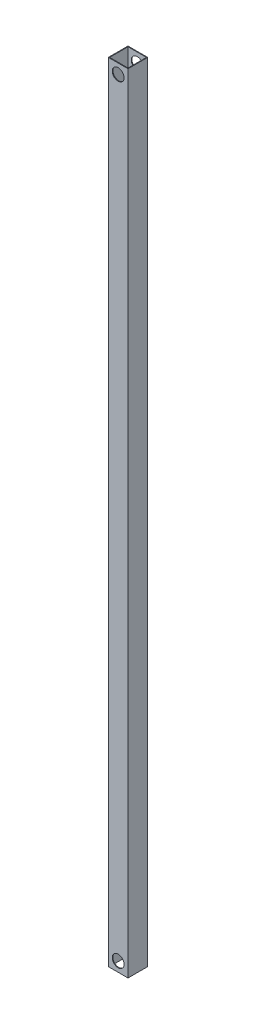
ISO-10303-21;
HEADER;
FILE_DESCRIPTION(('STEP AP214'),'2;1');
FILE_NAME('part.step','',(''),(''),'','','');
FILE_SCHEMA(('AUTOMOTIVE_DESIGN { 1 0 10303 214 1 1 1 1 }'));
ENDSEC;
DATA;
#1=APPLICATION_CONTEXT('core data for automotive mechanical design processes');
#2=APPLICATION_PROTOCOL_DEFINITION('international standard','automotive_design',2000,#1);
#3=PRODUCT_CONTEXT('',#1,'mechanical');
#4=PRODUCT('Part','Part','',(#3));
#5=PRODUCT_RELATED_PRODUCT_CATEGORY('part','',(#4));
#6=PRODUCT_DEFINITION_FORMATION('','',#4);
#7=PRODUCT_DEFINITION_CONTEXT('part definition',#1,'design');
#8=PRODUCT_DEFINITION('design','',#6,#7);
#9=PRODUCT_DEFINITION_SHAPE('','',#8);
#10=(LENGTH_UNIT() NAMED_UNIT(*) SI_UNIT(.MILLI.,.METRE.));
#11=(NAMED_UNIT(*) PLANE_ANGLE_UNIT() SI_UNIT($,.RADIAN.));
#12=(NAMED_UNIT(*) SI_UNIT($,.STERADIAN.) SOLID_ANGLE_UNIT());
#13=UNCERTAINTY_MEASURE_WITH_UNIT(LENGTH_MEASURE(1.E-05),#10,'distance_accuracy_value','');
#14=(GEOMETRIC_REPRESENTATION_CONTEXT(3) GLOBAL_UNCERTAINTY_ASSIGNED_CONTEXT((#13)) GLOBAL_UNIT_ASSIGNED_CONTEXT((#10,
#11,#12)) REPRESENTATION_CONTEXT('',''));
#15=CARTESIAN_POINT('',(0.,0.,0.));
#16=DIRECTION('',(0.,0.,1.));
#17=DIRECTION('',(1.,0.,0.));
#18=AXIS2_PLACEMENT_3D('',#15,#16,#17);
#19=CARTESIAN_POINT('',(5.,400.,-5.));
#20=DIRECTION('',(-1.,0.,0.));
#21=DIRECTION('',(0.,0.,1.));
#22=AXIS2_PLACEMENT_3D('',#19,#20,#21);
#23=PLANE('',#22);
#24=DIRECTION('',(0.,0.,-1.));
#25=VECTOR('',#24,1.);
#26=CARTESIAN_POINT('',(5.,0.,-5.));
#27=LINE('',#26,#25);
#28=CARTESIAN_POINT('',(5.,0.,5.));
#29=VERTEX_POINT('',#28);
#30=CARTESIAN_POINT('',(5.,0.,-5.));
#31=VERTEX_POINT('',#30);
#32=EDGE_CURVE('E137',#29,#31,#27,.T.);
#33=ORIENTED_EDGE('',*,*,#32,.T.);
#34=DIRECTION('',(0.,-1.,0.));
#35=VECTOR('',#34,1.);
#36=CARTESIAN_POINT('',(5.,400.,-5.));
#37=LINE('',#36,#35);
#38=CARTESIAN_POINT('',(5.,400.,-5.));
#39=VERTEX_POINT('',#38);
#40=EDGE_CURVE('E179',#39,#31,#37,.T.);
#41=ORIENTED_EDGE('',*,*,#40,.F.);
#42=DIRECTION('',(0.,0.,-1.));
#43=VECTOR('',#42,1.);
#44=CARTESIAN_POINT('',(5.,400.,-5.));
#45=LINE('',#44,#43);
#46=CARTESIAN_POINT('',(5.,400.,5.));
#47=VERTEX_POINT('',#46);
#48=EDGE_CURVE('E142',#47,#39,#45,.T.);
#49=ORIENTED_EDGE('',*,*,#48,.F.);
#50=DIRECTION('',(0.,-1.,0.));
#51=VECTOR('',#50,1.);
#52=CARTESIAN_POINT('',(5.,400.,5.));
#53=LINE('',#52,#51);
#54=EDGE_CURVE('E156',#47,#29,#53,.T.);
#55=ORIENTED_EDGE('',*,*,#54,.T.);
#56=EDGE_LOOP('',(#33,#41,#49,#55));
#57=FACE_BOUND('',#56,.T.);
#58=ADVANCED_FACE('F39',(#57),#23,.F.);
#59=CARTESIAN_POINT('',(-5.,400.,-5.));
#60=DIRECTION('',(0.,0.,1.));
#61=DIRECTION('',(1.,0.,0.));
#62=AXIS2_PLACEMENT_3D('',#59,#60,#61);
#63=PLANE('',#62);
#64=CARTESIAN_POINT('',(0.,395.,-5.));
#65=DIRECTION('',(0.,0.,1.));
#66=DIRECTION('',(1.,0.,0.));
#67=AXIS2_PLACEMENT_3D('',#64,#65,#66);
#68=CIRCLE('',#67,3.);
#69=CARTESIAN_POINT('',(2.99999999999999,395.,-5.));
#70=VERTEX_POINT('',#69);
#71=EDGE_CURVE('E203',#70,#70,#68,.T.);
#72=ORIENTED_EDGE('',*,*,#71,.T.);
#73=EDGE_LOOP('',(#72));
#74=FACE_BOUND('',#73,.T.);
#75=CARTESIAN_POINT('',(0.,5.,-5.));
#76=DIRECTION('',(0.,0.,1.));
#77=DIRECTION('',(1.,0.,0.));
#78=AXIS2_PLACEMENT_3D('',#75,#76,#77);
#79=CIRCLE('',#78,3.);
#80=CARTESIAN_POINT('',(3.,5.,-5.));
#81=VERTEX_POINT('',#80);
#82=EDGE_CURVE('E200',#81,#81,#79,.T.);
#83=ORIENTED_EDGE('',*,*,#82,.T.);
#84=EDGE_LOOP('',(#83));
#85=FACE_BOUND('',#84,.T.);
#86=DIRECTION('',(-1.,0.,0.));
#87=VECTOR('',#86,1.);
#88=CARTESIAN_POINT('',(-5.,0.,-5.));
#89=LINE('',#88,#87);
#90=CARTESIAN_POINT('',(-5.,0.,-5.));
#91=VERTEX_POINT('',#90);
#92=EDGE_CURVE('E160',#31,#91,#89,.T.);
#93=ORIENTED_EDGE('',*,*,#92,.T.);
#94=DIRECTION('',(0.,-1.,0.));
#95=VECTOR('',#94,1.);
#96=CARTESIAN_POINT('',(-5.,400.,-5.));
#97=LINE('',#96,#95);
#98=CARTESIAN_POINT('',(-5.,400.,-5.));
#99=VERTEX_POINT('',#98);
#100=EDGE_CURVE('E175',#99,#91,#97,.T.);
#101=ORIENTED_EDGE('',*,*,#100,.F.);
#102=DIRECTION('',(-1.,0.,0.));
#103=VECTOR('',#102,1.);
#104=CARTESIAN_POINT('',(-5.,400.,-5.));
#105=LINE('',#104,#103);
#106=EDGE_CURVE('E146',#39,#99,#105,.T.);
#107=ORIENTED_EDGE('',*,*,#106,.F.);
#108=ORIENTED_EDGE('',*,*,#40,.T.);
#109=EDGE_LOOP('',(#93,#101,#107,#108));
#110=FACE_BOUND('',#109,.T.);
#111=ADVANCED_FACE('F218',(#74,#85,#110),#63,.F.);
#112=CARTESIAN_POINT('',(-5.,400.,-5.));
#113=DIRECTION('',(1.,0.,0.));
#114=DIRECTION('',(0.,0.,-1.));
#115=AXIS2_PLACEMENT_3D('',#112,#113,#114);
#116=PLANE('',#115);
#117=DIRECTION('',(0.,0.,1.));
#118=VECTOR('',#117,1.);
#119=CARTESIAN_POINT('',(-5.,0.,-5.));
#120=LINE('',#119,#118);
#121=CARTESIAN_POINT('',(-5.,0.,5.));
#122=VERTEX_POINT('',#121);
#123=EDGE_CURVE('E163',#91,#122,#120,.T.);
#124=ORIENTED_EDGE('',*,*,#123,.T.);
#125=DIRECTION('',(0.,-1.,0.));
#126=VECTOR('',#125,1.);
#127=CARTESIAN_POINT('',(-5.,400.,5.));
#128=LINE('',#127,#126);
#129=CARTESIAN_POINT('',(-5.,400.,5.));
#130=VERTEX_POINT('',#129);
#131=EDGE_CURVE('E171',#130,#122,#128,.T.);
#132=ORIENTED_EDGE('',*,*,#131,.F.);
#133=DIRECTION('',(0.,0.,1.));
#134=VECTOR('',#133,1.);
#135=CARTESIAN_POINT('',(-5.,400.,-5.));
#136=LINE('',#135,#134);
#137=EDGE_CURVE('E150',#99,#130,#136,.T.);
#138=ORIENTED_EDGE('',*,*,#137,.F.);
#139=ORIENTED_EDGE('',*,*,#100,.T.);
#140=EDGE_LOOP('',(#124,#132,#138,#139));
#141=FACE_BOUND('',#140,.T.);
#142=ADVANCED_FACE('F240',(#141),#116,.F.);
#143=CARTESIAN_POINT('',(-5.,400.,5.));
#144=DIRECTION('',(0.,0.,-1.));
#145=DIRECTION('',(-1.,0.,0.));
#146=AXIS2_PLACEMENT_3D('',#143,#144,#145);
#147=PLANE('',#146);
#148=CARTESIAN_POINT('',(0.,395.,5.));
#149=DIRECTION('',(0.,0.,1.));
#150=DIRECTION('',(1.,0.,0.));
#151=AXIS2_PLACEMENT_3D('',#148,#149,#150);
#152=CIRCLE('',#151,3.);
#153=CARTESIAN_POINT('',(2.99999999999999,395.,5.));
#154=VERTEX_POINT('',#153);
#155=EDGE_CURVE('E290',#154,#154,#152,.T.);
#156=ORIENTED_EDGE('',*,*,#155,.F.);
#157=EDGE_LOOP('',(#156));
#158=FACE_BOUND('',#157,.T.);
#159=CARTESIAN_POINT('',(0.,5.,5.));
#160=DIRECTION('',(0.,0.,1.));
#161=DIRECTION('',(1.,0.,0.));
#162=AXIS2_PLACEMENT_3D('',#159,#160,#161);
#163=CIRCLE('',#162,3.);
#164=CARTESIAN_POINT('',(3.,5.,5.));
#165=VERTEX_POINT('',#164);
#166=EDGE_CURVE('E194',#165,#165,#163,.T.);
#167=ORIENTED_EDGE('',*,*,#166,.F.);
#168=EDGE_LOOP('',(#167));
#169=FACE_BOUND('',#168,.T.);
#170=DIRECTION('',(1.,0.,0.));
#171=VECTOR('',#170,1.);
#172=CARTESIAN_POINT('',(-5.,0.,5.));
#173=LINE('',#172,#171);
#174=EDGE_CURVE('E147',#122,#29,#173,.T.);
#175=ORIENTED_EDGE('',*,*,#174,.T.);
#176=ORIENTED_EDGE('',*,*,#54,.F.);
#177=DIRECTION('',(1.,0.,0.));
#178=VECTOR('',#177,1.);
#179=CARTESIAN_POINT('',(-5.,400.,5.));
#180=LINE('',#179,#178);
#181=EDGE_CURVE('E153',#130,#47,#180,.T.);
#182=ORIENTED_EDGE('',*,*,#181,.F.);
#183=ORIENTED_EDGE('',*,*,#131,.T.);
#184=EDGE_LOOP('',(#175,#176,#182,#183));
#185=FACE_BOUND('',#184,.T.);
#186=ADVANCED_FACE('F255',(#158,#169,#185),#147,.F.);
#187=CARTESIAN_POINT('',(0.,400.,0.));
#188=DIRECTION('',(0.,1.,0.));
#189=DIRECTION('',(0.,0.,1.));
#190=AXIS2_PLACEMENT_3D('',#187,#188,#189);
#191=PLANE('',#190);
#192=DIRECTION('',(0.,0.,-1.));
#193=VECTOR('',#192,1.);
#194=CARTESIAN_POINT('',(4.683,400.,-4.683));
#195=LINE('',#194,#193);
#196=CARTESIAN_POINT('',(4.683,400.,4.683));
#197=VERTEX_POINT('',#196);
#198=CARTESIAN_POINT('',(4.683,400.,-4.683));
#199=VERTEX_POINT('',#198);
#200=EDGE_CURVE('E56',#197,#199,#195,.T.);
#201=ORIENTED_EDGE('',*,*,#200,.F.);
#202=DIRECTION('',(1.,0.,0.));
#203=VECTOR('',#202,1.);
#204=CARTESIAN_POINT('',(-4.683,400.,4.683));
#205=LINE('',#204,#203);
#206=CARTESIAN_POINT('',(-4.683,400.,4.683));
#207=VERTEX_POINT('',#206);
#208=EDGE_CURVE('E127',#207,#197,#205,.T.);
#209=ORIENTED_EDGE('',*,*,#208,.F.);
#210=DIRECTION('',(0.,0.,1.));
#211=VECTOR('',#210,1.);
#212=CARTESIAN_POINT('',(-4.683,400.,-4.683));
#213=LINE('',#212,#211);
#214=CARTESIAN_POINT('',(-4.683,400.,-4.683));
#215=VERTEX_POINT('',#214);
#216=EDGE_CURVE('E109',#215,#207,#213,.T.);
#217=ORIENTED_EDGE('',*,*,#216,.F.);
#218=DIRECTION('',(-1.,0.,0.));
#219=VECTOR('',#218,1.);
#220=CARTESIAN_POINT('',(-4.683,400.,-4.683));
#221=LINE('',#220,#219);
#222=EDGE_CURVE('E119',#199,#215,#221,.T.);
#223=ORIENTED_EDGE('',*,*,#222,.F.);
#224=EDGE_LOOP('',(#201,#209,#217,#223));
#225=FACE_BOUND('',#224,.T.);
#226=ORIENTED_EDGE('',*,*,#48,.T.);
#227=ORIENTED_EDGE('',*,*,#106,.T.);
#228=ORIENTED_EDGE('',*,*,#137,.T.);
#229=ORIENTED_EDGE('',*,*,#181,.T.);
#230=EDGE_LOOP('',(#226,#227,#228,#229));
#231=FACE_BOUND('',#230,.T.);
#232=ADVANCED_FACE('F124',(#225,#231),#191,.T.);
#233=CARTESIAN_POINT('',(0.,0.,0.));
#234=DIRECTION('',(0.,1.,0.));
#235=DIRECTION('',(0.,0.,1.));
#236=AXIS2_PLACEMENT_3D('',#233,#234,#235);
#237=PLANE('',#236);
#238=DIRECTION('',(1.,0.,0.));
#239=VECTOR('',#238,1.);
#240=CARTESIAN_POINT('',(0.,0.,4.683));
#241=LINE('',#240,#239);
#242=CARTESIAN_POINT('',(-4.683,0.,4.683));
#243=VERTEX_POINT('',#242);
#244=CARTESIAN_POINT('',(4.683,0.,4.683));
#245=VERTEX_POINT('',#244);
#246=EDGE_CURVE('E48',#243,#245,#241,.T.);
#247=ORIENTED_EDGE('',*,*,#246,.T.);
#248=DIRECTION('',(0.,0.,-1.));
#249=VECTOR('',#248,1.);
#250=CARTESIAN_POINT('',(4.683,0.,0.));
#251=LINE('',#250,#249);
#252=CARTESIAN_POINT('',(4.683,0.,-4.683));
#253=VERTEX_POINT('',#252);
#254=EDGE_CURVE('E11',#245,#253,#251,.T.);
#255=ORIENTED_EDGE('',*,*,#254,.T.);
#256=DIRECTION('',(-1.,0.,0.));
#257=VECTOR('',#256,1.);
#258=CARTESIAN_POINT('',(0.,0.,-4.683));
#259=LINE('',#258,#257);
#260=CARTESIAN_POINT('',(-4.683,0.,-4.683));
#261=VERTEX_POINT('',#260);
#262=EDGE_CURVE('E183',#253,#261,#259,.T.);
#263=ORIENTED_EDGE('',*,*,#262,.T.);
#264=DIRECTION('',(0.,0.,1.));
#265=VECTOR('',#264,1.);
#266=CARTESIAN_POINT('',(-4.683,0.,0.));
#267=LINE('',#266,#265);
#268=EDGE_CURVE('E112',#261,#243,#267,.T.);
#269=ORIENTED_EDGE('',*,*,#268,.T.);
#270=EDGE_LOOP('',(#247,#255,#263,#269));
#271=FACE_BOUND('',#270,.T.);
#272=ORIENTED_EDGE('',*,*,#32,.F.);
#273=ORIENTED_EDGE('',*,*,#174,.F.);
#274=ORIENTED_EDGE('',*,*,#123,.F.);
#275=ORIENTED_EDGE('',*,*,#92,.F.);
#276=EDGE_LOOP('',(#272,#273,#274,#275));
#277=FACE_BOUND('',#276,.T.);
#278=ADVANCED_FACE('F248',(#271,#277),#237,.F.);
#279=CARTESIAN_POINT('',(4.683,-100.,-4.683));
#280=DIRECTION('',(1.,0.,0.));
#281=DIRECTION('',(0.,0.,-1.));
#282=AXIS2_PLACEMENT_3D('',#279,#280,#281);
#283=PLANE('',#282);
#284=DIRECTION('',(0.,1.,0.));
#285=VECTOR('',#284,1.);
#286=CARTESIAN_POINT('',(4.683,-100.,4.683));
#287=LINE('',#286,#285);
#288=EDGE_CURVE('E134',#245,#197,#287,.T.);
#289=ORIENTED_EDGE('',*,*,#288,.T.);
#290=ORIENTED_EDGE('',*,*,#200,.T.);
#291=DIRECTION('',(0.,1.,0.));
#292=VECTOR('',#291,1.);
#293=CARTESIAN_POINT('',(4.683,-100.,-4.683));
#294=LINE('',#293,#292);
#295=EDGE_CURVE('E116',#253,#199,#294,.T.);
#296=ORIENTED_EDGE('',*,*,#295,.F.);
#297=ORIENTED_EDGE('',*,*,#254,.F.);
#298=EDGE_LOOP('',(#289,#290,#296,#297));
#299=FACE_BOUND('',#298,.T.);
#300=ADVANCED_FACE('F267',(#299),#283,.F.);
#301=CARTESIAN_POINT('',(-4.683,-100.,4.683));
#302=DIRECTION('',(0.,0.,1.));
#303=DIRECTION('',(1.,0.,0.));
#304=AXIS2_PLACEMENT_3D('',#301,#302,#303);
#305=PLANE('',#304);
#306=CARTESIAN_POINT('',(0.,395.,4.68299999999999));
#307=DIRECTION('',(0.,0.,1.));
#308=DIRECTION('',(1.,0.,0.));
#309=AXIS2_PLACEMENT_3D('',#306,#307,#308);
#310=CIRCLE('',#309,3.);
#311=CARTESIAN_POINT('',(2.99999999999999,395.,4.68299999999999));
#312=VERTEX_POINT('',#311);
#313=EDGE_CURVE('E209',#312,#312,#310,.T.);
#314=ORIENTED_EDGE('',*,*,#313,.T.);
#315=EDGE_LOOP('',(#314));
#316=FACE_BOUND('',#315,.T.);
#317=CARTESIAN_POINT('',(0.,5.,4.68299999999999));
#318=DIRECTION('',(0.,0.,1.));
#319=DIRECTION('',(1.,0.,0.));
#320=AXIS2_PLACEMENT_3D('',#317,#318,#319);
#321=CIRCLE('',#320,3.);
#322=CARTESIAN_POINT('',(3.,5.,4.68299999999999));
#323=VERTEX_POINT('',#322);
#324=EDGE_CURVE('E193',#323,#323,#321,.T.);
#325=ORIENTED_EDGE('',*,*,#324,.T.);
#326=EDGE_LOOP('',(#325));
#327=FACE_BOUND('',#326,.T.);
#328=DIRECTION('',(0.,1.,0.));
#329=VECTOR('',#328,1.);
#330=CARTESIAN_POINT('',(-4.683,-100.,4.683));
#331=LINE('',#330,#329);
#332=EDGE_CURVE('E115',#243,#207,#331,.T.);
#333=ORIENTED_EDGE('',*,*,#332,.T.);
#334=ORIENTED_EDGE('',*,*,#208,.T.);
#335=ORIENTED_EDGE('',*,*,#288,.F.);
#336=ORIENTED_EDGE('',*,*,#246,.F.);
#337=EDGE_LOOP('',(#333,#334,#335,#336));
#338=FACE_BOUND('',#337,.T.);
#339=ADVANCED_FACE('F272',(#316,#327,#338),#305,.F.);
#340=CARTESIAN_POINT('',(-4.683,-100.,-4.683));
#341=DIRECTION('',(-1.,0.,0.));
#342=DIRECTION('',(0.,0.,1.));
#343=AXIS2_PLACEMENT_3D('',#340,#341,#342);
#344=PLANE('',#343);
#345=DIRECTION('',(0.,1.,0.));
#346=VECTOR('',#345,1.);
#347=CARTESIAN_POINT('',(-4.683,-100.,-4.683));
#348=LINE('',#347,#346);
#349=EDGE_CURVE('E64',#261,#215,#348,.T.);
#350=ORIENTED_EDGE('',*,*,#349,.T.);
#351=ORIENTED_EDGE('',*,*,#216,.T.);
#352=ORIENTED_EDGE('',*,*,#332,.F.);
#353=ORIENTED_EDGE('',*,*,#268,.F.);
#354=EDGE_LOOP('',(#350,#351,#352,#353));
#355=FACE_BOUND('',#354,.T.);
#356=ADVANCED_FACE('F106',(#355),#344,.F.);
#357=CARTESIAN_POINT('',(-4.683,-100.,-4.683));
#358=DIRECTION('',(0.,0.,-1.));
#359=DIRECTION('',(-1.,0.,0.));
#360=AXIS2_PLACEMENT_3D('',#357,#358,#359);
#361=PLANE('',#360);
#362=CARTESIAN_POINT('',(0.,395.,-4.68299999999999));
#363=DIRECTION('',(0.,0.,-1.));
#364=DIRECTION('',(-1.,0.,0.));
#365=AXIS2_PLACEMENT_3D('',#362,#363,#364);
#366=CIRCLE('',#365,3.);
#367=CARTESIAN_POINT('',(-3.00000000000001,395.,-4.68299999999999));
#368=VERTEX_POINT('',#367);
#369=EDGE_CURVE('E42',#368,#368,#366,.T.);
#370=ORIENTED_EDGE('',*,*,#369,.T.);
#371=EDGE_LOOP('',(#370));
#372=FACE_BOUND('',#371,.T.);
#373=CARTESIAN_POINT('',(0.,5.,-4.68299999999999));
#374=DIRECTION('',(0.,0.,-1.));
#375=DIRECTION('',(-1.,0.,0.));
#376=AXIS2_PLACEMENT_3D('',#373,#374,#375);
#377=CIRCLE('',#376,3.);
#378=CARTESIAN_POINT('',(-3.,5.,-4.68299999999999));
#379=VERTEX_POINT('',#378);
#380=EDGE_CURVE('E190',#379,#379,#377,.T.);
#381=ORIENTED_EDGE('',*,*,#380,.T.);
#382=EDGE_LOOP('',(#381));
#383=FACE_BOUND('',#382,.T.);
#384=ORIENTED_EDGE('',*,*,#295,.T.);
#385=ORIENTED_EDGE('',*,*,#222,.T.);
#386=ORIENTED_EDGE('',*,*,#349,.F.);
#387=ORIENTED_EDGE('',*,*,#262,.F.);
#388=EDGE_LOOP('',(#384,#385,#386,#387));
#389=FACE_BOUND('',#388,.T.);
#390=ADVANCED_FACE('F120',(#372,#383,#389),#361,.F.);
#391=CARTESIAN_POINT('',(0.,5.,-495.));
#392=DIRECTION('',(0.,0.,1.));
#393=DIRECTION('',(1.,0.,0.));
#394=AXIS2_PLACEMENT_3D('',#391,#392,#393);
#395=CYLINDRICAL_SURFACE('',#394,3.);
#396=ORIENTED_EDGE('',*,*,#380,.F.);
#397=EDGE_LOOP('',(#396));
#398=FACE_BOUND('',#397,.T.);
#399=ORIENTED_EDGE('',*,*,#82,.F.);
#400=EDGE_LOOP('',(#399));
#401=FACE_BOUND('',#400,.T.);
#402=ADVANCED_FACE('F221',(#398,#401),#395,.F.);
#403=ORIENTED_EDGE('',*,*,#166,.T.);
#404=EDGE_LOOP('',(#403));
#405=FACE_BOUND('',#404,.T.);
#406=ORIENTED_EDGE('',*,*,#324,.F.);
#407=EDGE_LOOP('',(#406));
#408=FACE_BOUND('',#407,.T.);
#409=ADVANCED_FACE('F223',(#405,#408),#395,.F.);
#410=CARTESIAN_POINT('',(0.,395.,-495.));
#411=DIRECTION('',(0.,0.,1.));
#412=DIRECTION('',(1.,0.,0.));
#413=AXIS2_PLACEMENT_3D('',#410,#411,#412);
#414=CYLINDRICAL_SURFACE('',#413,3.);
#415=ORIENTED_EDGE('',*,*,#369,.F.);
#416=EDGE_LOOP('',(#415));
#417=FACE_BOUND('',#416,.T.);
#418=ORIENTED_EDGE('',*,*,#71,.F.);
#419=EDGE_LOOP('',(#418));
#420=FACE_BOUND('',#419,.T.);
#421=ADVANCED_FACE('F230',(#417,#420),#414,.F.);
#422=ORIENTED_EDGE('',*,*,#155,.T.);
#423=EDGE_LOOP('',(#422));
#424=FACE_BOUND('',#423,.T.);
#425=ORIENTED_EDGE('',*,*,#313,.F.);
#426=EDGE_LOOP('',(#425));
#427=FACE_BOUND('',#426,.T.);
#428=ADVANCED_FACE('F296',(#424,#427),#414,.F.);
#429=CLOSED_SHELL('',(#58,#111,#142,#186,#232,#278,#300,#339,#356,#390,#402,#409,#421,#428));
#430=MANIFOLD_SOLID_BREP('B2',#429);
#431=ADVANCED_BREP_SHAPE_REPRESENTATION('',(#18,#430),#14);
#432=SHAPE_DEFINITION_REPRESENTATION(#9,#431);
ENDSEC;
END-ISO-10303-21;
